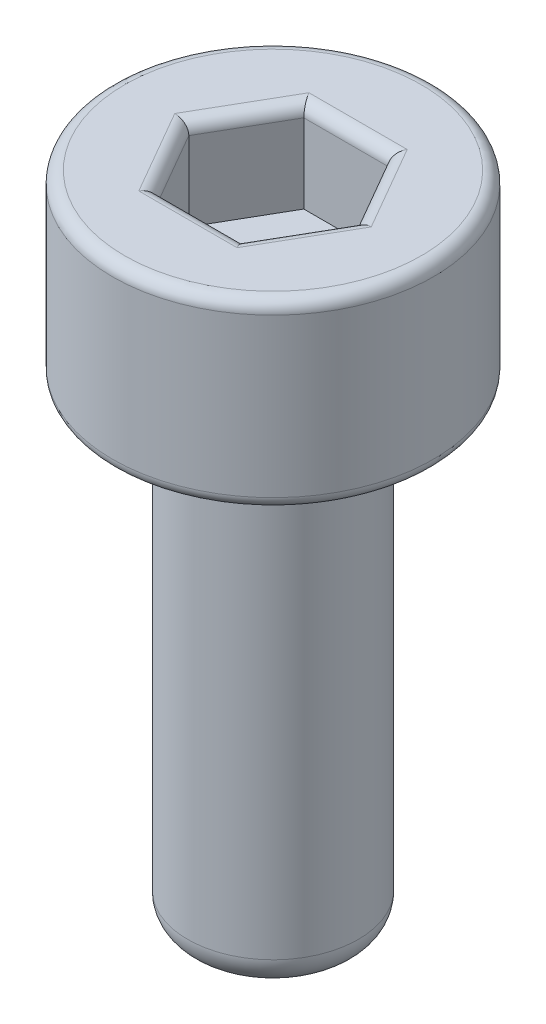
ISO-10303-21;
HEADER;
FILE_DESCRIPTION(('STEP AP214'),'2;1');
FILE_NAME('part.step','',(''),(''),'','','');
FILE_SCHEMA(('AUTOMOTIVE_DESIGN { 1 0 10303 214 1 1 1 1 }'));
ENDSEC;
DATA;
#1=APPLICATION_CONTEXT('core data for automotive mechanical design processes');
#2=APPLICATION_PROTOCOL_DEFINITION('international standard','automotive_design',2000,#1);
#3=PRODUCT_CONTEXT('',#1,'mechanical');
#4=PRODUCT('Part','Part','',(#3));
#5=PRODUCT_RELATED_PRODUCT_CATEGORY('part','',(#4));
#6=PRODUCT_DEFINITION_FORMATION('','',#4);
#7=PRODUCT_DEFINITION_CONTEXT('part definition',#1,'design');
#8=PRODUCT_DEFINITION('design','',#6,#7);
#9=PRODUCT_DEFINITION_SHAPE('','',#8);
#10=(LENGTH_UNIT() NAMED_UNIT(*) SI_UNIT(.MILLI.,.METRE.));
#11=(NAMED_UNIT(*) PLANE_ANGLE_UNIT() SI_UNIT($,.RADIAN.));
#12=(NAMED_UNIT(*) SI_UNIT($,.STERADIAN.) SOLID_ANGLE_UNIT());
#13=UNCERTAINTY_MEASURE_WITH_UNIT(LENGTH_MEASURE(1.E-05),#10,'distance_accuracy_value','');
#14=(GEOMETRIC_REPRESENTATION_CONTEXT(3) GLOBAL_UNCERTAINTY_ASSIGNED_CONTEXT((#13)) GLOBAL_UNIT_ASSIGNED_CONTEXT((#10,
#11,#12)) REPRESENTATION_CONTEXT('',''));
#15=CARTESIAN_POINT('',(0.,0.,0.));
#16=DIRECTION('',(0.,0.,1.));
#17=DIRECTION('',(1.,0.,0.));
#18=AXIS2_PLACEMENT_3D('',#15,#16,#17);
#19=CARTESIAN_POINT('',(0.,3.,0.));
#20=DIRECTION('',(0.,-1.,0.));
#21=DIRECTION('',(0.,0.,-1.));
#22=AXIS2_PLACEMENT_3D('',#19,#20,#21);
#23=CYLINDRICAL_SURFACE('',#22,2.64);
#24=CARTESIAN_POINT('',(0.,2.8,0.));
#25=DIRECTION('',(0.,1.,0.));
#26=DIRECTION('',(0.,0.,1.));
#27=AXIS2_PLACEMENT_3D('',#24,#25,#26);
#28=CIRCLE('',#27,2.64);
#29=CARTESIAN_POINT('',(0.,2.8,2.64));
#30=VERTEX_POINT('',#29);
#31=EDGE_CURVE('E186',#30,#30,#28,.F.);
#32=ORIENTED_EDGE('',*,*,#31,.T.);
#33=EDGE_LOOP('',(#32));
#34=FACE_BOUND('',#33,.T.);
#35=CARTESIAN_POINT('',(0.,0.2,0.));
#36=DIRECTION('',(0.,1.,0.));
#37=DIRECTION('',(0.,0.,1.));
#38=AXIS2_PLACEMENT_3D('',#35,#36,#37);
#39=CIRCLE('',#38,2.64);
#40=CARTESIAN_POINT('',(0.,0.2,2.64));
#41=VERTEX_POINT('',#40);
#42=EDGE_CURVE('E182',#41,#41,#39,.T.);
#43=ORIENTED_EDGE('',*,*,#42,.T.);
#44=EDGE_LOOP('',(#43));
#45=FACE_BOUND('',#44,.T.);
#46=ADVANCED_FACE('F39',(#34,#45),#23,.T.);
#47=CARTESIAN_POINT('',(0.,3.,0.));
#48=DIRECTION('',(0.,1.,0.));
#49=DIRECTION('',(0.,0.,1.));
#50=AXIS2_PLACEMENT_3D('',#47,#48,#49);
#51=PLANE('',#50);
#52=DIRECTION('',(-1.,0.,0.));
#53=VECTOR('',#52,1.);
#54=CARTESIAN_POINT('',(0.692820323027551,3.,-1.4));
#55=LINE('',#54,#53);
#56=CARTESIAN_POINT('',(-0.808290376865475,3.,-1.4));
#57=VERTEX_POINT('',#56);
#58=CARTESIAN_POINT('',(0.808290376865476,3.,-1.4));
#59=VERTEX_POINT('',#58);
#60=EDGE_CURVE('E209',#57,#59,#55,.F.);
#61=ORIENTED_EDGE('',*,*,#60,.T.);
#62=DIRECTION('',(-0.5,0.,-0.866025403784439));
#63=VECTOR('',#62,1.);
#64=CARTESIAN_POINT('',(1.55884572681199,3.,-0.0999999999999999));
#65=LINE('',#64,#63);
#66=CARTESIAN_POINT('',(1.61658075373095,3.,0.));
#67=VERTEX_POINT('',#66);
#68=EDGE_CURVE('E212',#59,#67,#65,.F.);
#69=ORIENTED_EDGE('',*,*,#68,.T.);
#70=DIRECTION('',(0.5,0.,-0.866025403784439));
#71=VECTOR('',#70,1.);
#72=CARTESIAN_POINT('',(0.866025403784438,3.,1.3));
#73=LINE('',#72,#71);
#74=CARTESIAN_POINT('',(0.808290376865476,3.,1.4));
#75=VERTEX_POINT('',#74);
#76=EDGE_CURVE('E197',#67,#75,#73,.F.);
#77=ORIENTED_EDGE('',*,*,#76,.T.);
#78=DIRECTION('',(1.,0.,0.));
#79=VECTOR('',#78,1.);
#80=CARTESIAN_POINT('',(-0.692820323027551,3.,1.4));
#81=LINE('',#80,#79);
#82=CARTESIAN_POINT('',(-0.808290376865476,3.,1.4));
#83=VERTEX_POINT('',#82);
#84=EDGE_CURVE('E200',#75,#83,#81,.F.);
#85=ORIENTED_EDGE('',*,*,#84,.T.);
#86=DIRECTION('',(0.5,0.,0.866025403784439));
#87=VECTOR('',#86,1.);
#88=CARTESIAN_POINT('',(-1.55884572681199,3.,0.1));
#89=LINE('',#88,#87);
#90=CARTESIAN_POINT('',(-1.61658075373095,3.,0.));
#91=VERTEX_POINT('',#90);
#92=EDGE_CURVE('E203',#83,#91,#89,.F.);
#93=ORIENTED_EDGE('',*,*,#92,.T.);
#94=DIRECTION('',(-0.5,0.,0.866025403784439));
#95=VECTOR('',#94,1.);
#96=CARTESIAN_POINT('',(-0.866025403784438,3.,-1.3));
#97=LINE('',#96,#95);
#98=EDGE_CURVE('E206',#91,#57,#97,.F.);
#99=ORIENTED_EDGE('',*,*,#98,.T.);
#100=EDGE_LOOP('',(#61,#69,#77,#85,#93,#99));
#101=FACE_BOUND('',#100,.T.);
#102=CARTESIAN_POINT('',(0.,3.,0.));
#103=DIRECTION('',(0.,1.,0.));
#104=DIRECTION('',(0.,0.,1.));
#105=AXIS2_PLACEMENT_3D('',#102,#103,#104);
#106=CIRCLE('',#105,2.44);
#107=CARTESIAN_POINT('',(0.,3.,2.44));
#108=VERTEX_POINT('',#107);
#109=EDGE_CURVE('E178',#108,#108,#106,.T.);
#110=ORIENTED_EDGE('',*,*,#109,.T.);
#111=EDGE_LOOP('',(#110));
#112=FACE_BOUND('',#111,.T.);
#113=ADVANCED_FACE('F261',(#101,#112),#51,.T.);
#114=CARTESIAN_POINT('',(0.,0.,0.));
#115=DIRECTION('',(0.,1.,0.));
#116=DIRECTION('',(0.,0.,1.));
#117=AXIS2_PLACEMENT_3D('',#114,#115,#116);
#118=PLANE('',#117);
#119=CARTESIAN_POINT('',(0.,0.,0.));
#120=DIRECTION('',(0.,1.,0.));
#121=DIRECTION('',(0.,0.,1.));
#122=AXIS2_PLACEMENT_3D('',#119,#120,#121);
#123=CIRCLE('',#122,2.44);
#124=CARTESIAN_POINT('',(0.,0.,2.44));
#125=VERTEX_POINT('',#124);
#126=EDGE_CURVE('E190',#125,#125,#123,.F.);
#127=ORIENTED_EDGE('',*,*,#126,.T.);
#128=EDGE_LOOP('',(#127));
#129=FACE_BOUND('',#128,.T.);
#130=CARTESIAN_POINT('',(0.,0.,0.));
#131=DIRECTION('',(0.,-1.,0.));
#132=DIRECTION('',(0.,0.,-1.));
#133=AXIS2_PLACEMENT_3D('',#130,#131,#132);
#134=CIRCLE('',#133,1.405);
#135=CARTESIAN_POINT('',(0.,0.,-1.405));
#136=VERTEX_POINT('',#135);
#137=EDGE_CURVE('E162',#136,#136,#134,.T.);
#138=ORIENTED_EDGE('',*,*,#137,.F.);
#139=EDGE_LOOP('',(#138));
#140=FACE_BOUND('',#139,.T.);
#141=ADVANCED_FACE('F267',(#129,#140),#118,.F.);
#142=CARTESIAN_POINT('',(0.,-7.76,0.));
#143=DIRECTION('',(0.,1.,0.));
#144=DIRECTION('',(0.,0.,1.));
#145=AXIS2_PLACEMENT_3D('',#142,#143,#144);
#146=CYLINDRICAL_SURFACE('',#145,1.405);
#147=CARTESIAN_POINT('',(0.,-7.26,0.));
#148=DIRECTION('',(0.,-1.,0.));
#149=DIRECTION('',(0.,0.,-1.));
#150=AXIS2_PLACEMENT_3D('',#147,#148,#149);
#151=CIRCLE('',#150,1.405);
#152=CARTESIAN_POINT('',(0.,-7.26,-1.405));
#153=VERTEX_POINT('',#152);
#154=EDGE_CURVE('E11',#153,#153,#151,.F.);
#155=ORIENTED_EDGE('',*,*,#154,.T.);
#156=EDGE_LOOP('',(#155));
#157=FACE_BOUND('',#156,.T.);
#158=ORIENTED_EDGE('',*,*,#137,.T.);
#159=EDGE_LOOP('',(#158));
#160=FACE_BOUND('',#159,.T.);
#161=ADVANCED_FACE('F342',(#157,#160),#146,.T.);
#162=CARTESIAN_POINT('',(0.,-7.76,0.));
#163=DIRECTION('',(0.,-1.,0.));
#164=DIRECTION('',(0.,0.,-1.));
#165=AXIS2_PLACEMENT_3D('',#162,#163,#164);
#166=PLANE('',#165);
#167=CARTESIAN_POINT('',(0.,-7.76,0.));
#168=DIRECTION('',(0.,-1.,0.));
#169=DIRECTION('',(0.,0.,-1.));
#170=AXIS2_PLACEMENT_3D('',#167,#168,#169);
#171=CIRCLE('',#170,0.905);
#172=CARTESIAN_POINT('',(0.,-7.76,-0.905));
#173=VERTEX_POINT('',#172);
#174=EDGE_CURVE('E48',#173,#173,#171,.T.);
#175=ORIENTED_EDGE('',*,*,#174,.T.);
#176=EDGE_LOOP('',(#175));
#177=FACE_BOUND('',#176,.T.);
#178=ADVANCED_FACE('F248',(#177),#166,.T.);
#179=CARTESIAN_POINT('',(0.,2.8,0.));
#180=DIRECTION('',(0.,1.,0.));
#181=DIRECTION('',(0.,0.,1.));
#182=AXIS2_PLACEMENT_3D('',#179,#180,#181);
#183=TOROIDAL_SURFACE('',#182,2.44,0.2);
#184=ORIENTED_EDGE('',*,*,#31,.F.);
#185=EDGE_LOOP('',(#184));
#186=FACE_BOUND('',#185,.T.);
#187=ORIENTED_EDGE('',*,*,#109,.F.);
#188=EDGE_LOOP('',(#187));
#189=FACE_BOUND('',#188,.T.);
#190=ADVANCED_FACE('F273',(#186,#189),#183,.T.);
#191=CARTESIAN_POINT('',(0.,0.2,0.));
#192=DIRECTION('',(0.,1.,0.));
#193=DIRECTION('',(0.,0.,1.));
#194=AXIS2_PLACEMENT_3D('',#191,#192,#193);
#195=TOROIDAL_SURFACE('',#194,2.44,0.2);
#196=ORIENTED_EDGE('',*,*,#126,.F.);
#197=EDGE_LOOP('',(#196));
#198=FACE_BOUND('',#197,.T.);
#199=ORIENTED_EDGE('',*,*,#42,.F.);
#200=EDGE_LOOP('',(#199));
#201=FACE_BOUND('',#200,.T.);
#202=ADVANCED_FACE('F276',(#198,#201),#195,.T.);
#203=CARTESIAN_POINT('',(0.692820323027551,1.5,1.2));
#204=DIRECTION('',(0.866025403784439,0.,0.5));
#205=DIRECTION('',(0.5,0.,-0.866025403784439));
#206=AXIS2_PLACEMENT_3D('',#203,#204,#205);
#207=PLANE('',#206);
#208=DIRECTION('',(0.,1.,0.));
#209=VECTOR('',#208,1.);
#210=CARTESIAN_POINT('',(0.692820323027551,1.5,1.2));
#211=LINE('',#210,#209);
#212=CARTESIAN_POINT('',(0.692820323027551,1.5,1.2));
#213=VERTEX_POINT('',#212);
#214=CARTESIAN_POINT('',(0.692820323027551,2.8,1.2));
#215=VERTEX_POINT('',#214);
#216=EDGE_CURVE('E159',#213,#215,#211,.T.);
#217=ORIENTED_EDGE('',*,*,#216,.T.);
#218=DIRECTION('',(0.5,0.,-0.866025403784439));
#219=VECTOR('',#218,1.);
#220=CARTESIAN_POINT('',(1.3856406460551,2.8,0.));
#221=LINE('',#220,#219);
#222=CARTESIAN_POINT('',(1.3856406460551,2.8,0.));
#223=VERTEX_POINT('',#222);
#224=EDGE_CURVE('E119',#215,#223,#221,.T.);
#225=ORIENTED_EDGE('',*,*,#224,.T.);
#226=DIRECTION('',(0.,1.,0.));
#227=VECTOR('',#226,1.);
#228=CARTESIAN_POINT('',(1.3856406460551,1.5,0.));
#229=LINE('',#228,#227);
#230=CARTESIAN_POINT('',(1.3856406460551,1.5,0.));
#231=VERTEX_POINT('',#230);
#232=EDGE_CURVE('E112',#231,#223,#229,.T.);
#233=ORIENTED_EDGE('',*,*,#232,.F.);
#234=DIRECTION('',(0.5,0.,-0.866025403784439));
#235=VECTOR('',#234,1.);
#236=CARTESIAN_POINT('',(0.692820323027551,1.5,1.2));
#237=LINE('',#236,#235);
#238=EDGE_CURVE('E116',#213,#231,#237,.T.);
#239=ORIENTED_EDGE('',*,*,#238,.F.);
#240=EDGE_LOOP('',(#217,#225,#233,#239));
#241=FACE_BOUND('',#240,.T.);
#242=ADVANCED_FACE('F114',(#241),#207,.F.);
#243=CARTESIAN_POINT('',(-0.692820323027551,1.5,1.2));
#244=DIRECTION('',(0.,0.,1.));
#245=DIRECTION('',(1.,0.,0.));
#246=AXIS2_PLACEMENT_3D('',#243,#244,#245);
#247=PLANE('',#246);
#248=DIRECTION('',(0.,1.,0.));
#249=VECTOR('',#248,1.);
#250=CARTESIAN_POINT('',(-0.692820323027551,1.5,1.2));
#251=LINE('',#250,#249);
#252=CARTESIAN_POINT('',(-0.692820323027551,1.5,1.2));
#253=VERTEX_POINT('',#252);
#254=CARTESIAN_POINT('',(-0.692820323027551,2.8,1.2));
#255=VERTEX_POINT('',#254);
#256=EDGE_CURVE('E163',#253,#255,#251,.T.);
#257=ORIENTED_EDGE('',*,*,#256,.T.);
#258=DIRECTION('',(1.,0.,0.));
#259=VECTOR('',#258,1.);
#260=CARTESIAN_POINT('',(0.692820323027551,2.8,1.2));
#261=LINE('',#260,#259);
#262=EDGE_CURVE('E55',#255,#215,#261,.T.);
#263=ORIENTED_EDGE('',*,*,#262,.T.);
#264=ORIENTED_EDGE('',*,*,#216,.F.);
#265=DIRECTION('',(1.,0.,0.));
#266=VECTOR('',#265,1.);
#267=CARTESIAN_POINT('',(-0.692820323027551,1.5,1.2));
#268=LINE('',#267,#266);
#269=EDGE_CURVE('E125',#253,#213,#268,.T.);
#270=ORIENTED_EDGE('',*,*,#269,.F.);
#271=EDGE_LOOP('',(#257,#263,#264,#270));
#272=FACE_BOUND('',#271,.T.);
#273=ADVANCED_FACE('F324',(#272),#247,.F.);
#274=CARTESIAN_POINT('',(-1.3856406460551,1.5,0.));
#275=DIRECTION('',(-0.866025403784439,0.,0.5));
#276=DIRECTION('',(0.5,0.,0.866025403784439));
#277=AXIS2_PLACEMENT_3D('',#274,#275,#276);
#278=PLANE('',#277);
#279=DIRECTION('',(0.,1.,0.));
#280=VECTOR('',#279,1.);
#281=CARTESIAN_POINT('',(-1.3856406460551,1.5,0.));
#282=LINE('',#281,#280);
#283=CARTESIAN_POINT('',(-1.3856406460551,1.5,0.));
#284=VERTEX_POINT('',#283);
#285=CARTESIAN_POINT('',(-1.3856406460551,2.8,0.));
#286=VERTEX_POINT('',#285);
#287=EDGE_CURVE('E166',#284,#286,#282,.T.);
#288=ORIENTED_EDGE('',*,*,#287,.T.);
#289=DIRECTION('',(0.5,0.,0.866025403784439));
#290=VECTOR('',#289,1.);
#291=CARTESIAN_POINT('',(-0.692820323027551,2.8,1.2));
#292=LINE('',#291,#290);
#293=EDGE_CURVE('E63',#286,#255,#292,.T.);
#294=ORIENTED_EDGE('',*,*,#293,.T.);
#295=ORIENTED_EDGE('',*,*,#256,.F.);
#296=DIRECTION('',(0.5,0.,0.866025403784439));
#297=VECTOR('',#296,1.);
#298=CARTESIAN_POINT('',(-1.3856406460551,1.5,0.));
#299=LINE('',#298,#297);
#300=EDGE_CURVE('E154',#284,#253,#299,.T.);
#301=ORIENTED_EDGE('',*,*,#300,.F.);
#302=EDGE_LOOP('',(#288,#294,#295,#301));
#303=FACE_BOUND('',#302,.T.);
#304=ADVANCED_FACE('F323',(#303),#278,.F.);
#305=CARTESIAN_POINT('',(-0.69282032302755,1.5,-1.2));
#306=DIRECTION('',(-0.866025403784439,0.,-0.5));
#307=DIRECTION('',(-0.5,0.,0.866025403784439));
#308=AXIS2_PLACEMENT_3D('',#305,#306,#307);
#309=PLANE('',#308);
#310=DIRECTION('',(0.,1.,0.));
#311=VECTOR('',#310,1.);
#312=CARTESIAN_POINT('',(-0.69282032302755,1.5,-1.2));
#313=LINE('',#312,#311);
#314=CARTESIAN_POINT('',(-0.69282032302755,1.5,-1.2));
#315=VERTEX_POINT('',#314);
#316=CARTESIAN_POINT('',(-0.69282032302755,2.8,-1.2));
#317=VERTEX_POINT('',#316);
#318=EDGE_CURVE('E169',#315,#317,#313,.T.);
#319=ORIENTED_EDGE('',*,*,#318,.T.);
#320=DIRECTION('',(-0.5,0.,0.866025403784439));
#321=VECTOR('',#320,1.);
#322=CARTESIAN_POINT('',(-1.3856406460551,2.8,0.));
#323=LINE('',#322,#321);
#324=EDGE_CURVE('E219',#317,#286,#323,.T.);
#325=ORIENTED_EDGE('',*,*,#324,.T.);
#326=ORIENTED_EDGE('',*,*,#287,.F.);
#327=DIRECTION('',(-0.5,0.,0.866025403784439));
#328=VECTOR('',#327,1.);
#329=CARTESIAN_POINT('',(-0.69282032302755,1.5,-1.2));
#330=LINE('',#329,#328);
#331=EDGE_CURVE('E150',#315,#284,#330,.T.);
#332=ORIENTED_EDGE('',*,*,#331,.F.);
#333=EDGE_LOOP('',(#319,#325,#326,#332));
#334=FACE_BOUND('',#333,.T.);
#335=ADVANCED_FACE('F322',(#334),#309,.F.);
#336=CARTESIAN_POINT('',(0.692820323027551,1.5,-1.2));
#337=DIRECTION('',(0.,0.,-1.));
#338=DIRECTION('',(-1.,0.,0.));
#339=AXIS2_PLACEMENT_3D('',#336,#337,#338);
#340=PLANE('',#339);
#341=DIRECTION('',(0.,1.,0.));
#342=VECTOR('',#341,1.);
#343=CARTESIAN_POINT('',(0.692820323027551,1.5,-1.2));
#344=LINE('',#343,#342);
#345=CARTESIAN_POINT('',(0.692820323027551,1.5,-1.2));
#346=VERTEX_POINT('',#345);
#347=CARTESIAN_POINT('',(0.692820323027551,2.8,-1.2));
#348=VERTEX_POINT('',#347);
#349=EDGE_CURVE('E124',#346,#348,#344,.T.);
#350=ORIENTED_EDGE('',*,*,#349,.T.);
#351=DIRECTION('',(-1.,0.,0.));
#352=VECTOR('',#351,1.);
#353=CARTESIAN_POINT('',(-0.69282032302755,2.8,-1.2));
#354=LINE('',#353,#352);
#355=EDGE_CURVE('E216',#348,#317,#354,.T.);
#356=ORIENTED_EDGE('',*,*,#355,.T.);
#357=ORIENTED_EDGE('',*,*,#318,.F.);
#358=DIRECTION('',(-1.,0.,0.));
#359=VECTOR('',#358,1.);
#360=CARTESIAN_POINT('',(0.692820323027551,1.5,-1.2));
#361=LINE('',#360,#359);
#362=EDGE_CURVE('E135',#346,#315,#361,.T.);
#363=ORIENTED_EDGE('',*,*,#362,.F.);
#364=EDGE_LOOP('',(#350,#356,#357,#363));
#365=FACE_BOUND('',#364,.T.);
#366=ADVANCED_FACE('F318',(#365),#340,.F.);
#367=CARTESIAN_POINT('',(1.3856406460551,1.5,0.));
#368=DIRECTION('',(0.866025403784439,0.,-0.5));
#369=DIRECTION('',(-0.5,0.,-0.866025403784439));
#370=AXIS2_PLACEMENT_3D('',#367,#368,#369);
#371=PLANE('',#370);
#372=ORIENTED_EDGE('',*,*,#232,.T.);
#373=DIRECTION('',(-0.5,0.,-0.866025403784439));
#374=VECTOR('',#373,1.);
#375=CARTESIAN_POINT('',(0.692820323027551,2.8,-1.2));
#376=LINE('',#375,#374);
#377=EDGE_CURVE('E194',#223,#348,#376,.T.);
#378=ORIENTED_EDGE('',*,*,#377,.T.);
#379=ORIENTED_EDGE('',*,*,#349,.F.);
#380=DIRECTION('',(-0.5,0.,-0.866025403784439));
#381=VECTOR('',#380,1.);
#382=CARTESIAN_POINT('',(1.3856406460551,1.5,0.));
#383=LINE('',#382,#381);
#384=EDGE_CURVE('E128',#231,#346,#383,.T.);
#385=ORIENTED_EDGE('',*,*,#384,.F.);
#386=EDGE_LOOP('',(#372,#378,#379,#385));
#387=FACE_BOUND('',#386,.T.);
#388=ADVANCED_FACE('F129',(#387),#371,.F.);
#389=CARTESIAN_POINT('',(0.,1.5,0.));
#390=DIRECTION('',(0.,1.,0.));
#391=DIRECTION('',(0.,0.,1.));
#392=AXIS2_PLACEMENT_3D('',#389,#390,#391);
#393=PLANE('',#392);
#394=ORIENTED_EDGE('',*,*,#238,.T.);
#395=ORIENTED_EDGE('',*,*,#384,.T.);
#396=ORIENTED_EDGE('',*,*,#362,.T.);
#397=ORIENTED_EDGE('',*,*,#331,.T.);
#398=ORIENTED_EDGE('',*,*,#300,.T.);
#399=ORIENTED_EDGE('',*,*,#269,.T.);
#400=EDGE_LOOP('',(#394,#395,#396,#397,#398,#399));
#401=FACE_BOUND('',#400,.T.);
#402=ADVANCED_FACE('F137',(#401),#393,.T.);
#403=CARTESIAN_POINT('',(-1.55884572681199,2.8,0.1));
#404=DIRECTION('',(-0.5,0.,-0.866025403784439));
#405=DIRECTION('',(-0.866025403784439,0.,0.5));
#406=AXIS2_PLACEMENT_3D('',#403,#404,#405);
#407=CYLINDRICAL_SURFACE('',#406,0.2);
#408=CARTESIAN_POINT('',(-1.61658075373095,2.8,0.));
#409=DIRECTION('',(0.,0.,-1.));
#410=DIRECTION('',(1.,0.,0.));
#411=AXIS2_PLACEMENT_3D('',#408,#409,#410);
#412=ELLIPSE('',#411,0.23094010767585,0.2);
#413=EDGE_CURVE('E145',#91,#286,#412,.T.);
#414=ORIENTED_EDGE('',*,*,#413,.F.);
#415=ORIENTED_EDGE('',*,*,#92,.F.);
#416=CARTESIAN_POINT('',(-0.808290376865476,2.8,1.4));
#417=DIRECTION('',(-0.866025403784438,0.,-0.5));
#418=DIRECTION('',(0.5,0.,-0.866025403784439));
#419=AXIS2_PLACEMENT_3D('',#416,#417,#418);
#420=ELLIPSE('',#419,0.23094010767585,0.2);
#421=EDGE_CURVE('E141',#255,#83,#420,.F.);
#422=ORIENTED_EDGE('',*,*,#421,.F.);
#423=ORIENTED_EDGE('',*,*,#293,.F.);
#424=EDGE_LOOP('',(#414,#415,#422,#423));
#425=FACE_BOUND('',#424,.T.);
#426=ADVANCED_FACE('F294',(#425),#407,.T.);
#427=CARTESIAN_POINT('',(-0.692820323027551,2.8,1.4));
#428=DIRECTION('',(-1.,0.,0.));
#429=DIRECTION('',(0.,0.,1.));
#430=AXIS2_PLACEMENT_3D('',#427,#428,#429);
#431=CYLINDRICAL_SURFACE('',#430,0.2);
#432=ORIENTED_EDGE('',*,*,#421,.T.);
#433=ORIENTED_EDGE('',*,*,#84,.F.);
#434=CARTESIAN_POINT('',(0.808290376865476,2.8,1.4));
#435=DIRECTION('',(-0.866025403784439,0.,0.5));
#436=DIRECTION('',(-0.5,0.,-0.866025403784439));
#437=AXIS2_PLACEMENT_3D('',#434,#435,#436);
#438=ELLIPSE('',#437,0.23094010767585,0.2);
#439=EDGE_CURVE('E238',#215,#75,#438,.F.);
#440=ORIENTED_EDGE('',*,*,#439,.F.);
#441=ORIENTED_EDGE('',*,*,#262,.F.);
#442=EDGE_LOOP('',(#432,#433,#440,#441));
#443=FACE_BOUND('',#442,.T.);
#444=ADVANCED_FACE('F291',(#443),#431,.T.);
#445=CARTESIAN_POINT('',(-0.866025403784438,2.8,-1.3));
#446=DIRECTION('',(0.5,0.,-0.866025403784439));
#447=DIRECTION('',(-0.866025403784439,0.,-0.5));
#448=AXIS2_PLACEMENT_3D('',#445,#446,#447);
#449=CYLINDRICAL_SURFACE('',#448,0.2);
#450=ORIENTED_EDGE('',*,*,#413,.T.);
#451=ORIENTED_EDGE('',*,*,#324,.F.);
#452=CARTESIAN_POINT('',(-0.808290376865475,2.8,-1.4));
#453=DIRECTION('',(0.866025403784439,0.,-0.5));
#454=DIRECTION('',(0.5,0.,0.866025403784439));
#455=AXIS2_PLACEMENT_3D('',#452,#453,#454);
#456=ELLIPSE('',#455,0.23094010767585,0.2);
#457=EDGE_CURVE('E234',#57,#317,#456,.T.);
#458=ORIENTED_EDGE('',*,*,#457,.F.);
#459=ORIENTED_EDGE('',*,*,#98,.F.);
#460=EDGE_LOOP('',(#450,#451,#458,#459));
#461=FACE_BOUND('',#460,.T.);
#462=ADVANCED_FACE('F287',(#461),#449,.T.);
#463=CARTESIAN_POINT('',(0.866025403784438,2.8,1.3));
#464=DIRECTION('',(-0.5,0.,0.866025403784439));
#465=DIRECTION('',(0.866025403784439,0.,0.5));
#466=AXIS2_PLACEMENT_3D('',#463,#464,#465);
#467=CYLINDRICAL_SURFACE('',#466,0.2);
#468=ORIENTED_EDGE('',*,*,#439,.T.);
#469=ORIENTED_EDGE('',*,*,#76,.F.);
#470=CARTESIAN_POINT('',(1.61658075373095,2.8,0.));
#471=DIRECTION('',(0.,0.,1.));
#472=DIRECTION('',(1.,0.,0.));
#473=AXIS2_PLACEMENT_3D('',#470,#471,#472);
#474=ELLIPSE('',#473,0.23094010767585,0.2);
#475=EDGE_CURVE('E231',#223,#67,#474,.F.);
#476=ORIENTED_EDGE('',*,*,#475,.F.);
#477=ORIENTED_EDGE('',*,*,#224,.F.);
#478=EDGE_LOOP('',(#468,#469,#476,#477));
#479=FACE_BOUND('',#478,.T.);
#480=ADVANCED_FACE('F283',(#479),#467,.T.);
#481=CARTESIAN_POINT('',(0.692820323027551,2.8,-1.4));
#482=DIRECTION('',(1.,0.,0.));
#483=DIRECTION('',(0.,0.,-1.));
#484=AXIS2_PLACEMENT_3D('',#481,#482,#483);
#485=CYLINDRICAL_SURFACE('',#484,0.2);
#486=ORIENTED_EDGE('',*,*,#457,.T.);
#487=ORIENTED_EDGE('',*,*,#355,.F.);
#488=CARTESIAN_POINT('',(0.808290376865476,2.8,-1.4));
#489=DIRECTION('',(0.866025403784439,0.,0.5));
#490=DIRECTION('',(-0.5,0.,0.866025403784439));
#491=AXIS2_PLACEMENT_3D('',#488,#489,#490);
#492=ELLIPSE('',#491,0.23094010767585,0.2);
#493=EDGE_CURVE('E228',#59,#348,#492,.T.);
#494=ORIENTED_EDGE('',*,*,#493,.F.);
#495=ORIENTED_EDGE('',*,*,#60,.F.);
#496=EDGE_LOOP('',(#486,#487,#494,#495));
#497=FACE_BOUND('',#496,.T.);
#498=ADVANCED_FACE('F256',(#497),#485,.T.);
#499=CARTESIAN_POINT('',(1.55884572681199,2.8,-0.0999999999999997));
#500=DIRECTION('',(0.5,0.,0.866025403784439));
#501=DIRECTION('',(0.866025403784439,0.,-0.5));
#502=AXIS2_PLACEMENT_3D('',#499,#500,#501);
#503=CYLINDRICAL_SURFACE('',#502,0.2);
#504=ORIENTED_EDGE('',*,*,#475,.T.);
#505=ORIENTED_EDGE('',*,*,#68,.F.);
#506=ORIENTED_EDGE('',*,*,#493,.T.);
#507=ORIENTED_EDGE('',*,*,#377,.F.);
#508=EDGE_LOOP('',(#504,#505,#506,#507));
#509=FACE_BOUND('',#508,.T.);
#510=ADVANCED_FACE('F251',(#509),#503,.T.);
#511=CARTESIAN_POINT('',(0.,-7.26,0.));
#512=DIRECTION('',(0.,-1.,0.));
#513=DIRECTION('',(0.,0.,-1.));
#514=AXIS2_PLACEMENT_3D('',#511,#512,#513);
#515=TOROIDAL_SURFACE('',#514,0.905,0.5);
#516=ORIENTED_EDGE('',*,*,#154,.F.);
#517=EDGE_LOOP('',(#516));
#518=FACE_BOUND('',#517,.T.);
#519=ORIENTED_EDGE('',*,*,#174,.F.);
#520=EDGE_LOOP('',(#519));
#521=FACE_BOUND('',#520,.T.);
#522=ADVANCED_FACE('F41',(#518,#521),#515,.T.);
#523=CLOSED_SHELL('',(#46,#113,#141,#161,#178,#190,#202,#242,#273,#304,#335,#366,#388,#402,#426,
#444,#462,#480,#498,#510,#522));
#524=MANIFOLD_SOLID_BREP('B2',#523);
#525=ADVANCED_BREP_SHAPE_REPRESENTATION('',(#18,#524),#14);
#526=SHAPE_DEFINITION_REPRESENTATION(#9,#525);
ENDSEC;
END-ISO-10303-21;
